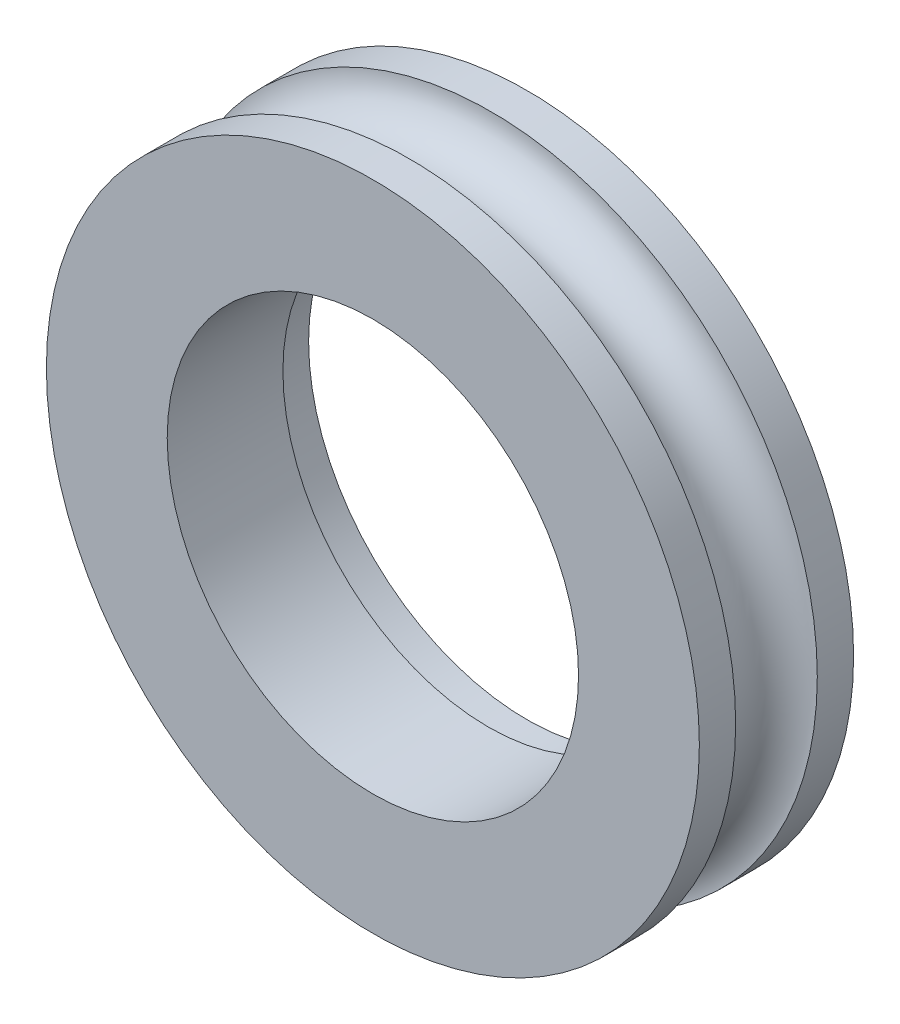
ISO-10303-21;
HEADER;
FILE_DESCRIPTION(('STEP AP214'),'2;1');
FILE_NAME('part.step','',(''),(''),'','','');
FILE_SCHEMA(('AUTOMOTIVE_DESIGN { 1 0 10303 214 1 1 1 1 }'));
ENDSEC;
DATA;
#1=APPLICATION_CONTEXT('core data for automotive mechanical design processes');
#2=APPLICATION_PROTOCOL_DEFINITION('international standard','automotive_design',2000,#1);
#3=PRODUCT_CONTEXT('',#1,'mechanical');
#4=PRODUCT('Part','Part','',(#3));
#5=PRODUCT_RELATED_PRODUCT_CATEGORY('part','',(#4));
#6=PRODUCT_DEFINITION_FORMATION('','',#4);
#7=PRODUCT_DEFINITION_CONTEXT('part definition',#1,'design');
#8=PRODUCT_DEFINITION('design','',#6,#7);
#9=PRODUCT_DEFINITION_SHAPE('','',#8);
#10=(LENGTH_UNIT() NAMED_UNIT(*) SI_UNIT(.MILLI.,.METRE.));
#11=(NAMED_UNIT(*) PLANE_ANGLE_UNIT() SI_UNIT($,.RADIAN.));
#12=(NAMED_UNIT(*) SI_UNIT($,.STERADIAN.) SOLID_ANGLE_UNIT());
#13=UNCERTAINTY_MEASURE_WITH_UNIT(LENGTH_MEASURE(1.E-05),#10,'distance_accuracy_value','');
#14=(GEOMETRIC_REPRESENTATION_CONTEXT(3) GLOBAL_UNCERTAINTY_ASSIGNED_CONTEXT((#13)) GLOBAL_UNIT_ASSIGNED_CONTEXT((#10,
#11,#12)) REPRESENTATION_CONTEXT('',''));
#15=CARTESIAN_POINT('',(0.,0.,0.));
#16=DIRECTION('',(0.,0.,1.));
#17=DIRECTION('',(1.,0.,0.));
#18=AXIS2_PLACEMENT_3D('',#15,#16,#17);
#19=CARTESIAN_POINT('',(0.,0.,0.));
#20=DIRECTION('',(0.,0.,1.));
#21=DIRECTION('',(1.,0.,0.));
#22=AXIS2_PLACEMENT_3D('',#19,#20,#21);
#23=CYLINDRICAL_SURFACE('',#22,16.);
#24=CARTESIAN_POINT('',(0.,0.,0.));
#25=DIRECTION('',(0.,0.,1.));
#26=DIRECTION('',(1.,0.,0.));
#27=AXIS2_PLACEMENT_3D('',#24,#25,#26);
#28=CIRCLE('',#27,16.);
#29=CARTESIAN_POINT('',(16.,0.,0.));
#30=VERTEX_POINT('',#29);
#31=EDGE_CURVE('E39',#30,#30,#28,.T.);
#32=ORIENTED_EDGE('',*,*,#31,.T.);
#33=EDGE_LOOP('',(#32));
#34=FACE_BOUND('',#33,.T.);
#35=CARTESIAN_POINT('',(0.,0.,-9.));
#36=DIRECTION('',(0.,0.,-1.));
#37=DIRECTION('',(-1.,0.,0.));
#38=AXIS2_PLACEMENT_3D('',#35,#36,#37);
#39=CIRCLE('',#38,16.);
#40=CARTESIAN_POINT('',(-16.,0.,-9.));
#41=VERTEX_POINT('',#40);
#42=EDGE_CURVE('E35',#41,#41,#39,.T.);
#43=ORIENTED_EDGE('',*,*,#42,.T.);
#44=EDGE_LOOP('',(#43));
#45=FACE_BOUND('',#44,.T.);
#46=ADVANCED_FACE('F31',(#34,#45),#23,.F.);
#47=CARTESIAN_POINT('',(0.,0.,0.));
#48=DIRECTION('',(0.,0.,1.));
#49=DIRECTION('',(1.,0.,0.));
#50=AXIS2_PLACEMENT_3D('',#47,#48,#49);
#51=CYLINDRICAL_SURFACE('',#50,25.4);
#52=CARTESIAN_POINT('',(0.,0.,-12.));
#53=DIRECTION('',(0.,0.,1.));
#54=DIRECTION('',(1.,0.,0.));
#55=AXIS2_PLACEMENT_3D('',#52,#53,#54);
#56=CIRCLE('',#55,25.4);
#57=CARTESIAN_POINT('',(25.4,0.,-12.));
#58=VERTEX_POINT('',#57);
#59=EDGE_CURVE('E10',#58,#58,#56,.T.);
#60=ORIENTED_EDGE('',*,*,#59,.T.);
#61=EDGE_LOOP('',(#60));
#62=FACE_BOUND('',#61,.T.);
#63=CARTESIAN_POINT('',(0.,0.,-9.175));
#64=DIRECTION('',(0.,0.,1.));
#65=DIRECTION('',(1.,0.,0.));
#66=AXIS2_PLACEMENT_3D('',#63,#64,#65);
#67=CIRCLE('',#66,25.4);
#68=CARTESIAN_POINT('',(25.4,0.,-9.175));
#69=VERTEX_POINT('',#68);
#70=EDGE_CURVE('E51',#69,#69,#67,.T.);
#71=ORIENTED_EDGE('',*,*,#70,.F.);
#72=EDGE_LOOP('',(#71));
#73=FACE_BOUND('',#72,.T.);
#74=ADVANCED_FACE('F33',(#62,#73),#51,.T.);
#75=CARTESIAN_POINT('',(16.,0.,-12.));
#76=DIRECTION('',(0.,0.,-1.));
#77=DIRECTION('',(-1.,0.,0.));
#78=AXIS2_PLACEMENT_3D('',#75,#76,#77);
#79=PLANE('',#78);
#80=CARTESIAN_POINT('',(0.,0.,-12.));
#81=DIRECTION('',(0.,0.,-1.));
#82=DIRECTION('',(-1.,0.,0.));
#83=AXIS2_PLACEMENT_3D('',#80,#81,#82);
#84=CIRCLE('',#83,17.);
#85=CARTESIAN_POINT('',(-17.,0.,-12.));
#86=VERTEX_POINT('',#85);
#87=EDGE_CURVE('E54',#86,#86,#84,.T.);
#88=ORIENTED_EDGE('',*,*,#87,.F.);
#89=EDGE_LOOP('',(#88));
#90=FACE_BOUND('',#89,.T.);
#91=ORIENTED_EDGE('',*,*,#59,.F.);
#92=EDGE_LOOP('',(#91));
#93=FACE_BOUND('',#92,.T.);
#94=ADVANCED_FACE('F81',(#90,#93),#79,.T.);
#95=CARTESIAN_POINT('',(16.,0.,0.));
#96=DIRECTION('',(0.,0.,1.));
#97=DIRECTION('',(1.,0.,0.));
#98=AXIS2_PLACEMENT_3D('',#95,#96,#97);
#99=PLANE('',#98);
#100=CARTESIAN_POINT('',(0.,0.,0.));
#101=DIRECTION('',(0.,0.,1.));
#102=DIRECTION('',(1.,0.,0.));
#103=AXIS2_PLACEMENT_3D('',#100,#101,#102);
#104=CIRCLE('',#103,25.4);
#105=CARTESIAN_POINT('',(25.4,0.,0.));
#106=VERTEX_POINT('',#105);
#107=EDGE_CURVE('E43',#106,#106,#104,.T.);
#108=ORIENTED_EDGE('',*,*,#107,.T.);
#109=EDGE_LOOP('',(#108));
#110=FACE_BOUND('',#109,.T.);
#111=ORIENTED_EDGE('',*,*,#31,.F.);
#112=EDGE_LOOP('',(#111));
#113=FACE_BOUND('',#112,.T.);
#114=ADVANCED_FACE('F83',(#110,#113),#99,.T.);
#115=CARTESIAN_POINT('',(0.,0.,0.));
#116=DIRECTION('',(0.,0.,1.));
#117=DIRECTION('',(1.,0.,0.));
#118=AXIS2_PLACEMENT_3D('',#115,#116,#117);
#119=CYLINDRICAL_SURFACE('',#118,25.4);
#120=CARTESIAN_POINT('',(0.,0.,-2.825));
#121=DIRECTION('',(0.,0.,1.));
#122=DIRECTION('',(1.,0.,0.));
#123=AXIS2_PLACEMENT_3D('',#120,#121,#122);
#124=CIRCLE('',#123,25.4);
#125=CARTESIAN_POINT('',(25.4,0.,-2.825));
#126=VERTEX_POINT('',#125);
#127=EDGE_CURVE('E48',#126,#126,#124,.T.);
#128=ORIENTED_EDGE('',*,*,#127,.T.);
#129=EDGE_LOOP('',(#128));
#130=FACE_BOUND('',#129,.T.);
#131=ORIENTED_EDGE('',*,*,#107,.F.);
#132=EDGE_LOOP('',(#131));
#133=FACE_BOUND('',#132,.T.);
#134=ADVANCED_FACE('F90',(#130,#133),#119,.T.);
#135=CARTESIAN_POINT('',(0.,0.,-6.));
#136=DIRECTION('',(0.,0.,1.));
#137=DIRECTION('',(1.,0.,0.));
#138=AXIS2_PLACEMENT_3D('',#135,#136,#137);
#139=TOROIDAL_SURFACE('',#138,25.4,3.175);
#140=ORIENTED_EDGE('',*,*,#70,.T.);
#141=EDGE_LOOP('',(#140));
#142=FACE_BOUND('',#141,.T.);
#143=ORIENTED_EDGE('',*,*,#127,.F.);
#144=EDGE_LOOP('',(#143));
#145=FACE_BOUND('',#144,.T.);
#146=ADVANCED_FACE('F72',(#142,#145),#139,.F.);
#147=CARTESIAN_POINT('',(0.,0.,-9.));
#148=DIRECTION('',(0.,0.,-1.));
#149=DIRECTION('',(-1.,0.,0.));
#150=AXIS2_PLACEMENT_3D('',#147,#148,#149);
#151=CYLINDRICAL_SURFACE('',#150,17.);
#152=CARTESIAN_POINT('',(0.,0.,-9.));
#153=DIRECTION('',(0.,0.,-1.));
#154=DIRECTION('',(-1.,0.,0.));
#155=AXIS2_PLACEMENT_3D('',#152,#153,#154);
#156=CIRCLE('',#155,17.);
#157=CARTESIAN_POINT('',(-17.,0.,-9.));
#158=VERTEX_POINT('',#157);
#159=EDGE_CURVE('E57',#158,#158,#156,.T.);
#160=ORIENTED_EDGE('',*,*,#159,.F.);
#161=EDGE_LOOP('',(#160));
#162=FACE_BOUND('',#161,.T.);
#163=ORIENTED_EDGE('',*,*,#87,.T.);
#164=EDGE_LOOP('',(#163));
#165=FACE_BOUND('',#164,.T.);
#166=ADVANCED_FACE('F67',(#162,#165),#151,.F.);
#167=CARTESIAN_POINT('',(0.,0.,-9.));
#168=DIRECTION('',(0.,0.,-1.));
#169=DIRECTION('',(-1.,0.,0.));
#170=AXIS2_PLACEMENT_3D('',#167,#168,#169);
#171=PLANE('',#170);
#172=ORIENTED_EDGE('',*,*,#42,.F.);
#173=EDGE_LOOP('',(#172));
#174=FACE_BOUND('',#173,.T.);
#175=ORIENTED_EDGE('',*,*,#159,.T.);
#176=EDGE_LOOP('',(#175));
#177=FACE_BOUND('',#176,.T.);
#178=ADVANCED_FACE('F65',(#174,#177),#171,.T.);
#179=CLOSED_SHELL('',(#46,#74,#94,#114,#134,#146,#166,#178));
#180=MANIFOLD_SOLID_BREP('B2',#179);
#181=ADVANCED_BREP_SHAPE_REPRESENTATION('',(#18,#180),#14);
#182=SHAPE_DEFINITION_REPRESENTATION(#9,#181);
ENDSEC;
END-ISO-10303-21;
